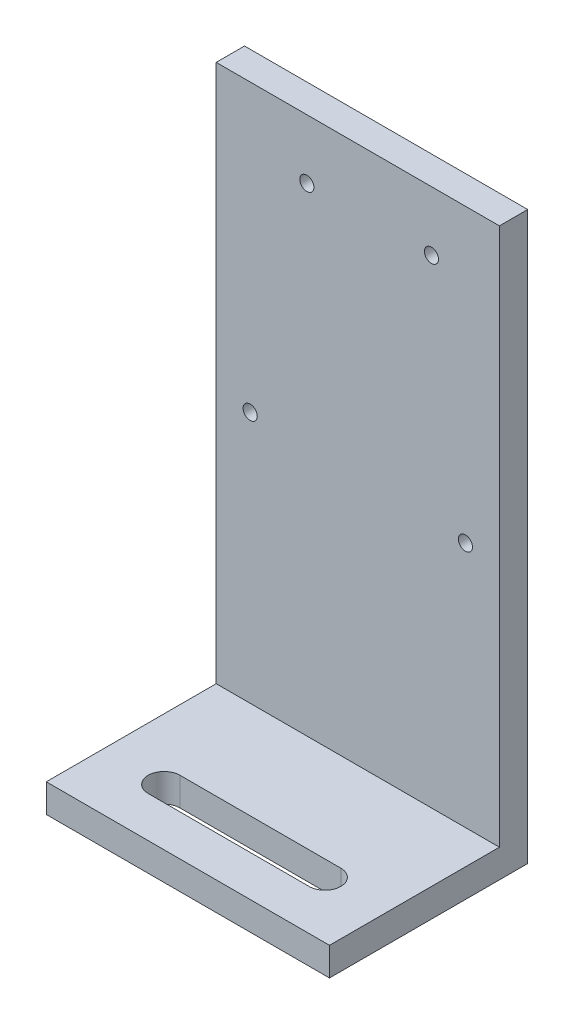
ISO-10303-21;
HEADER;
FILE_DESCRIPTION(('STEP AP214'),'2;1');
FILE_NAME('part.step','',(''),(''),'','','');
FILE_SCHEMA(('AUTOMOTIVE_DESIGN { 1 0 10303 214 1 1 1 1 }'));
ENDSEC;
DATA;
#1=APPLICATION_CONTEXT('core data for automotive mechanical design processes');
#2=APPLICATION_PROTOCOL_DEFINITION('international standard','automotive_design',2000,#1);
#3=PRODUCT_CONTEXT('',#1,'mechanical');
#4=PRODUCT('Part','Part','',(#3));
#5=PRODUCT_RELATED_PRODUCT_CATEGORY('part','',(#4));
#6=PRODUCT_DEFINITION_FORMATION('','',#4);
#7=PRODUCT_DEFINITION_CONTEXT('part definition',#1,'design');
#8=PRODUCT_DEFINITION('design','',#6,#7);
#9=PRODUCT_DEFINITION_SHAPE('','',#8);
#10=(LENGTH_UNIT() NAMED_UNIT(*) SI_UNIT(.MILLI.,.METRE.));
#11=(NAMED_UNIT(*) PLANE_ANGLE_UNIT() SI_UNIT($,.RADIAN.));
#12=(NAMED_UNIT(*) SI_UNIT($,.STERADIAN.) SOLID_ANGLE_UNIT());
#13=UNCERTAINTY_MEASURE_WITH_UNIT(LENGTH_MEASURE(1.E-05),#10,'distance_accuracy_value','');
#14=(GEOMETRIC_REPRESENTATION_CONTEXT(3) GLOBAL_UNCERTAINTY_ASSIGNED_CONTEXT((#13)) GLOBAL_UNIT_ASSIGNED_CONTEXT((#10,
#11,#12)) REPRESENTATION_CONTEXT('',''));
#15=CARTESIAN_POINT('',(0.,0.,0.));
#16=DIRECTION('',(0.,0.,1.));
#17=DIRECTION('',(1.,0.,0.));
#18=AXIS2_PLACEMENT_3D('',#15,#16,#17);
#19=CARTESIAN_POINT('',(0.,0.,6.35));
#20=DIRECTION('',(0.,1.,0.));
#21=DIRECTION('',(0.,0.,1.));
#22=AXIS2_PLACEMENT_3D('',#19,#20,#21);
#23=PLANE('',#22);
#24=DIRECTION('',(1.,0.,0.));
#25=VECTOR('',#24,1.);
#26=CARTESIAN_POINT('',(0.,0.,0.));
#27=LINE('',#26,#25);
#28=CARTESIAN_POINT('',(0.,0.,0.));
#29=VERTEX_POINT('',#28);
#30=CARTESIAN_POINT('',(63.5,0.,0.));
#31=VERTEX_POINT('',#30);
#32=EDGE_CURVE('E227',#29,#31,#27,.T.);
#33=ORIENTED_EDGE('',*,*,#32,.T.);
#34=DIRECTION('',(0.,0.,-1.));
#35=VECTOR('',#34,1.);
#36=CARTESIAN_POINT('',(63.5,0.,6.35));
#37=LINE('',#36,#35);
#38=CARTESIAN_POINT('',(63.5,0.,44.45));
#39=VERTEX_POINT('',#38);
#40=EDGE_CURVE('E49',#39,#31,#37,.T.);
#41=ORIENTED_EDGE('',*,*,#40,.F.);
#42=DIRECTION('',(1.,0.,0.));
#43=VECTOR('',#42,1.);
#44=CARTESIAN_POINT('',(0.,0.,44.45));
#45=LINE('',#44,#43);
#46=CARTESIAN_POINT('',(0.,0.,44.45));
#47=VERTEX_POINT('',#46);
#48=EDGE_CURVE('E169',#47,#39,#45,.T.);
#49=ORIENTED_EDGE('',*,*,#48,.F.);
#50=DIRECTION('',(0.,0.,-1.));
#51=VECTOR('',#50,1.);
#52=CARTESIAN_POINT('',(0.,0.,6.35));
#53=LINE('',#52,#51);
#54=EDGE_CURVE('E11',#47,#29,#53,.T.);
#55=ORIENTED_EDGE('',*,*,#54,.T.);
#56=EDGE_LOOP('',(#33,#41,#49,#55));
#57=FACE_BOUND('',#56,.T.);
#58=DIRECTION('',(1.,0.,0.));
#59=VECTOR('',#58,1.);
#60=CARTESIAN_POINT('',(13.716,0.,28.194));
#61=LINE('',#60,#59);
#62=CARTESIAN_POINT('',(13.716,0.,28.194));
#63=VERTEX_POINT('',#62);
#64=CARTESIAN_POINT('',(49.784,0.,28.194));
#65=VERTEX_POINT('',#64);
#66=EDGE_CURVE('E116',#63,#65,#61,.T.);
#67=ORIENTED_EDGE('',*,*,#66,.F.);
#68=CARTESIAN_POINT('',(13.716,0.,31.75));
#69=DIRECTION('',(0.,1.,0.));
#70=DIRECTION('',(0.,0.,1.));
#71=AXIS2_PLACEMENT_3D('',#68,#69,#70);
#72=CIRCLE('',#71,3.556);
#73=CARTESIAN_POINT('',(13.716,0.,35.306));
#74=VERTEX_POINT('',#73);
#75=EDGE_CURVE('E142',#63,#74,#72,.T.);
#76=ORIENTED_EDGE('',*,*,#75,.T.);
#77=DIRECTION('',(1.,0.,0.));
#78=VECTOR('',#77,1.);
#79=CARTESIAN_POINT('',(13.716,0.,35.306));
#80=LINE('',#79,#78);
#81=CARTESIAN_POINT('',(49.784,0.,35.306));
#82=VERTEX_POINT('',#81);
#83=EDGE_CURVE('E57',#74,#82,#80,.T.);
#84=ORIENTED_EDGE('',*,*,#83,.T.);
#85=CARTESIAN_POINT('',(49.784,0.,31.75));
#86=DIRECTION('',(0.,1.,0.));
#87=DIRECTION('',(0.,0.,1.));
#88=AXIS2_PLACEMENT_3D('',#85,#86,#87);
#89=CIRCLE('',#88,3.556);
#90=EDGE_CURVE('E127',#82,#65,#89,.T.);
#91=ORIENTED_EDGE('',*,*,#90,.T.);
#92=EDGE_LOOP('',(#67,#76,#84,#91));
#93=FACE_BOUND('',#92,.T.);
#94=ADVANCED_FACE('F39',(#57,#93),#23,.F.);
#95=CARTESIAN_POINT('',(0.,6.35,44.45));
#96=DIRECTION('',(0.,-1.,0.));
#97=DIRECTION('',(0.,0.,-1.));
#98=AXIS2_PLACEMENT_3D('',#95,#96,#97);
#99=PLANE('',#98);
#100=DIRECTION('',(-1.,0.,0.));
#101=VECTOR('',#100,1.);
#102=CARTESIAN_POINT('',(0.,6.35,6.35));
#103=LINE('',#102,#101);
#104=CARTESIAN_POINT('',(63.5,6.35,6.35));
#105=VERTEX_POINT('',#104);
#106=CARTESIAN_POINT('',(0.,6.35,6.35));
#107=VERTEX_POINT('',#106);
#108=EDGE_CURVE('E136',#105,#107,#103,.T.);
#109=ORIENTED_EDGE('',*,*,#108,.T.);
#110=DIRECTION('',(0.,0.,-1.));
#111=VECTOR('',#110,1.);
#112=CARTESIAN_POINT('',(0.,6.35,44.45));
#113=LINE('',#112,#111);
#114=CARTESIAN_POINT('',(0.,6.35,44.45));
#115=VERTEX_POINT('',#114);
#116=EDGE_CURVE('E179',#115,#107,#113,.T.);
#117=ORIENTED_EDGE('',*,*,#116,.F.);
#118=DIRECTION('',(-1.,0.,0.));
#119=VECTOR('',#118,1.);
#120=CARTESIAN_POINT('',(0.,6.35,44.45));
#121=LINE('',#120,#119);
#122=CARTESIAN_POINT('',(63.5,6.35,44.45));
#123=VERTEX_POINT('',#122);
#124=EDGE_CURVE('E176',#123,#115,#121,.T.);
#125=ORIENTED_EDGE('',*,*,#124,.F.);
#126=DIRECTION('',(0.,0.,-1.));
#127=VECTOR('',#126,1.);
#128=CARTESIAN_POINT('',(63.5,6.35,44.45));
#129=LINE('',#128,#127);
#130=EDGE_CURVE('E186',#123,#105,#129,.T.);
#131=ORIENTED_EDGE('',*,*,#130,.T.);
#132=EDGE_LOOP('',(#109,#117,#125,#131));
#133=FACE_BOUND('',#132,.T.);
#134=DIRECTION('',(1.,0.,0.));
#135=VECTOR('',#134,1.);
#136=CARTESIAN_POINT('',(13.716,6.35,28.194));
#137=LINE('',#136,#135);
#138=CARTESIAN_POINT('',(13.716,6.35,28.194));
#139=VERTEX_POINT('',#138);
#140=CARTESIAN_POINT('',(49.784,6.35,28.194));
#141=VERTEX_POINT('',#140);
#142=EDGE_CURVE('E65',#139,#141,#137,.T.);
#143=ORIENTED_EDGE('',*,*,#142,.T.);
#144=CARTESIAN_POINT('',(49.784,6.35,31.75));
#145=DIRECTION('',(0.,1.,0.));
#146=DIRECTION('',(0.,0.,1.));
#147=AXIS2_PLACEMENT_3D('',#144,#145,#146);
#148=CIRCLE('',#147,3.556);
#149=CARTESIAN_POINT('',(49.784,6.35,35.306));
#150=VERTEX_POINT('',#149);
#151=EDGE_CURVE('E134',#150,#141,#148,.T.);
#152=ORIENTED_EDGE('',*,*,#151,.F.);
#153=DIRECTION('',(1.,0.,0.));
#154=VECTOR('',#153,1.);
#155=CARTESIAN_POINT('',(13.716,6.35,35.306));
#156=LINE('',#155,#154);
#157=CARTESIAN_POINT('',(13.716,6.35,35.306));
#158=VERTEX_POINT('',#157);
#159=EDGE_CURVE('E151',#158,#150,#156,.T.);
#160=ORIENTED_EDGE('',*,*,#159,.F.);
#161=CARTESIAN_POINT('',(13.716,6.35,31.75));
#162=DIRECTION('',(0.,1.,0.));
#163=DIRECTION('',(0.,0.,1.));
#164=AXIS2_PLACEMENT_3D('',#161,#162,#163);
#165=CIRCLE('',#164,3.556);
#166=EDGE_CURVE('E128',#139,#158,#165,.T.);
#167=ORIENTED_EDGE('',*,*,#166,.F.);
#168=EDGE_LOOP('',(#143,#152,#160,#167));
#169=FACE_BOUND('',#168,.T.);
#170=ADVANCED_FACE('F277',(#133,#169),#99,.F.);
#171=CARTESIAN_POINT('',(0.,0.,6.35));
#172=DIRECTION('',(0.,0.,-1.));
#173=DIRECTION('',(-1.,0.,0.));
#174=AXIS2_PLACEMENT_3D('',#171,#172,#173);
#175=PLANE('',#174);
#176=CARTESIAN_POINT('',(48.26,113.665,6.35));
#177=DIRECTION('',(0.,0.,1.));
#178=DIRECTION('',(1.,0.,0.));
#179=AXIS2_PLACEMENT_3D('',#176,#177,#178);
#180=CIRCLE('',#179,1.5875);
#181=CARTESIAN_POINT('',(49.8475,113.665,6.35));
#182=VERTEX_POINT('',#181);
#183=EDGE_CURVE('E190',#182,#182,#180,.T.);
#184=ORIENTED_EDGE('',*,*,#183,.F.);
#185=EDGE_LOOP('',(#184));
#186=FACE_BOUND('',#185,.T.);
#187=CARTESIAN_POINT('',(20.32,113.665,6.35));
#188=DIRECTION('',(0.,0.,1.));
#189=DIRECTION('',(1.,0.,0.));
#190=AXIS2_PLACEMENT_3D('',#187,#188,#189);
#191=CIRCLE('',#190,1.5875);
#192=CARTESIAN_POINT('',(21.9075,113.665,6.35));
#193=VERTEX_POINT('',#192);
#194=EDGE_CURVE('E212',#193,#193,#191,.T.);
#195=ORIENTED_EDGE('',*,*,#194,.F.);
#196=EDGE_LOOP('',(#195));
#197=FACE_BOUND('',#196,.T.);
#198=CARTESIAN_POINT('',(7.62,62.865,6.35));
#199=DIRECTION('',(0.,0.,1.));
#200=DIRECTION('',(1.,0.,0.));
#201=AXIS2_PLACEMENT_3D('',#198,#199,#200);
#202=CIRCLE('',#201,1.5875);
#203=CARTESIAN_POINT('',(9.2075,62.865,6.35));
#204=VERTEX_POINT('',#203);
#205=EDGE_CURVE('E204',#204,#204,#202,.T.);
#206=ORIENTED_EDGE('',*,*,#205,.F.);
#207=EDGE_LOOP('',(#206));
#208=FACE_BOUND('',#207,.T.);
#209=CARTESIAN_POINT('',(55.88,61.595,6.35));
#210=DIRECTION('',(0.,0.,1.));
#211=DIRECTION('',(1.,0.,0.));
#212=AXIS2_PLACEMENT_3D('',#209,#210,#211);
#213=CIRCLE('',#212,1.5875);
#214=CARTESIAN_POINT('',(57.4675,61.595,6.35));
#215=VERTEX_POINT('',#214);
#216=EDGE_CURVE('E196',#215,#215,#213,.T.);
#217=ORIENTED_EDGE('',*,*,#216,.F.);
#218=EDGE_LOOP('',(#217));
#219=FACE_BOUND('',#218,.T.);
#220=ORIENTED_EDGE('',*,*,#108,.F.);
#221=DIRECTION('',(0.,1.,0.));
#222=VECTOR('',#221,1.);
#223=CARTESIAN_POINT('',(63.5,0.,6.35));
#224=LINE('',#223,#222);
#225=CARTESIAN_POINT('',(63.5,127.,6.35));
#226=VERTEX_POINT('',#225);
#227=EDGE_CURVE('E231',#105,#226,#224,.T.);
#228=ORIENTED_EDGE('',*,*,#227,.T.);
#229=DIRECTION('',(1.,0.,0.));
#230=VECTOR('',#229,1.);
#231=CARTESIAN_POINT('',(0.,127.,6.35));
#232=LINE('',#231,#230);
#233=CARTESIAN_POINT('',(0.,127.,6.35));
#234=VERTEX_POINT('',#233);
#235=EDGE_CURVE('E226',#234,#226,#232,.T.);
#236=ORIENTED_EDGE('',*,*,#235,.F.);
#237=DIRECTION('',(0.,1.,0.));
#238=VECTOR('',#237,1.);
#239=CARTESIAN_POINT('',(0.,0.,6.35));
#240=LINE('',#239,#238);
#241=EDGE_CURVE('E223',#107,#234,#240,.T.);
#242=ORIENTED_EDGE('',*,*,#241,.F.);
#243=EDGE_LOOP('',(#220,#228,#236,#242));
#244=FACE_BOUND('',#243,.T.);
#245=ADVANCED_FACE('F280',(#186,#197,#208,#219,#244),#175,.F.);
#246=CARTESIAN_POINT('',(0.,0.,6.35));
#247=DIRECTION('',(-1.,0.,0.));
#248=DIRECTION('',(0.,0.,1.));
#249=AXIS2_PLACEMENT_3D('',#246,#247,#248);
#250=PLANE('',#249);
#251=DIRECTION('',(0.,1.,0.));
#252=VECTOR('',#251,1.);
#253=CARTESIAN_POINT('',(0.,0.,0.));
#254=LINE('',#253,#252);
#255=CARTESIAN_POINT('',(0.,127.,0.));
#256=VERTEX_POINT('',#255);
#257=EDGE_CURVE('E195',#29,#256,#254,.T.);
#258=ORIENTED_EDGE('',*,*,#257,.F.);
#259=ORIENTED_EDGE('',*,*,#54,.F.);
#260=DIRECTION('',(0.,-1.,0.));
#261=VECTOR('',#260,1.);
#262=CARTESIAN_POINT('',(0.,0.,44.45));
#263=LINE('',#262,#261);
#264=EDGE_CURVE('E165',#115,#47,#263,.T.);
#265=ORIENTED_EDGE('',*,*,#264,.F.);
#266=ORIENTED_EDGE('',*,*,#116,.T.);
#267=ORIENTED_EDGE('',*,*,#241,.T.);
#268=DIRECTION('',(0.,0.,-1.));
#269=VECTOR('',#268,1.);
#270=CARTESIAN_POINT('',(0.,127.,6.35));
#271=LINE('',#270,#269);
#272=EDGE_CURVE('E43',#234,#256,#271,.T.);
#273=ORIENTED_EDGE('',*,*,#272,.T.);
#274=EDGE_LOOP('',(#258,#259,#265,#266,#267,#273));
#275=FACE_BOUND('',#274,.T.);
#276=ADVANCED_FACE('F41',(#275),#250,.T.);
#277=CARTESIAN_POINT('',(63.5,0.,6.35));
#278=DIRECTION('',(-1.,0.,0.));
#279=DIRECTION('',(0.,-1.,0.));
#280=AXIS2_PLACEMENT_3D('',#277,#278,#279);
#281=PLANE('',#280);
#282=DIRECTION('',(0.,1.,0.));
#283=VECTOR('',#282,1.);
#284=CARTESIAN_POINT('',(63.5,0.,0.));
#285=LINE('',#284,#283);
#286=CARTESIAN_POINT('',(63.5,127.,0.));
#287=VERTEX_POINT('',#286);
#288=EDGE_CURVE('E241',#31,#287,#285,.T.);
#289=ORIENTED_EDGE('',*,*,#288,.T.);
#290=DIRECTION('',(0.,0.,-1.));
#291=VECTOR('',#290,1.);
#292=CARTESIAN_POINT('',(63.5,127.,6.35));
#293=LINE('',#292,#291);
#294=EDGE_CURVE('E249',#226,#287,#293,.T.);
#295=ORIENTED_EDGE('',*,*,#294,.F.);
#296=ORIENTED_EDGE('',*,*,#227,.F.);
#297=ORIENTED_EDGE('',*,*,#130,.F.);
#298=DIRECTION('',(0.,1.,0.));
#299=VECTOR('',#298,1.);
#300=CARTESIAN_POINT('',(63.5,0.,44.45));
#301=LINE('',#300,#299);
#302=EDGE_CURVE('E173',#39,#123,#301,.T.);
#303=ORIENTED_EDGE('',*,*,#302,.F.);
#304=ORIENTED_EDGE('',*,*,#40,.T.);
#305=EDGE_LOOP('',(#289,#295,#296,#297,#303,#304));
#306=FACE_BOUND('',#305,.T.);
#307=ADVANCED_FACE('F268',(#306),#281,.F.);
#308=CARTESIAN_POINT('',(0.,127.,6.35));
#309=DIRECTION('',(0.,1.,0.));
#310=DIRECTION('',(0.,0.,1.));
#311=AXIS2_PLACEMENT_3D('',#308,#309,#310);
#312=PLANE('',#311);
#313=DIRECTION('',(1.,0.,0.));
#314=VECTOR('',#313,1.);
#315=CARTESIAN_POINT('',(0.,127.,0.));
#316=LINE('',#315,#314);
#317=EDGE_CURVE('E237',#256,#287,#316,.T.);
#318=ORIENTED_EDGE('',*,*,#317,.F.);
#319=ORIENTED_EDGE('',*,*,#272,.F.);
#320=ORIENTED_EDGE('',*,*,#235,.T.);
#321=ORIENTED_EDGE('',*,*,#294,.T.);
#322=EDGE_LOOP('',(#318,#319,#320,#321));
#323=FACE_BOUND('',#322,.T.);
#324=ADVANCED_FACE('F259',(#323),#312,.T.);
#325=CARTESIAN_POINT('',(0.,0.,0.));
#326=DIRECTION('',(0.,0.,-1.));
#327=DIRECTION('',(-1.,0.,0.));
#328=AXIS2_PLACEMENT_3D('',#325,#326,#327);
#329=PLANE('',#328);
#330=CARTESIAN_POINT('',(55.88,61.595,0.));
#331=DIRECTION('',(0.,0.,1.));
#332=DIRECTION('',(1.,0.,0.));
#333=AXIS2_PLACEMENT_3D('',#330,#331,#332);
#334=CIRCLE('',#333,1.5875);
#335=CARTESIAN_POINT('',(57.4675,61.595,0.));
#336=VERTEX_POINT('',#335);
#337=EDGE_CURVE('E191',#336,#336,#334,.T.);
#338=ORIENTED_EDGE('',*,*,#337,.T.);
#339=EDGE_LOOP('',(#338));
#340=FACE_BOUND('',#339,.T.);
#341=CARTESIAN_POINT('',(7.62,62.865,0.));
#342=DIRECTION('',(0.,0.,1.));
#343=DIRECTION('',(1.,0.,0.));
#344=AXIS2_PLACEMENT_3D('',#341,#342,#343);
#345=CIRCLE('',#344,1.5875);
#346=CARTESIAN_POINT('',(9.2075,62.865,0.));
#347=VERTEX_POINT('',#346);
#348=EDGE_CURVE('E200',#347,#347,#345,.T.);
#349=ORIENTED_EDGE('',*,*,#348,.T.);
#350=EDGE_LOOP('',(#349));
#351=FACE_BOUND('',#350,.T.);
#352=CARTESIAN_POINT('',(20.32,113.665,0.));
#353=DIRECTION('',(0.,0.,1.));
#354=DIRECTION('',(1.,0.,0.));
#355=AXIS2_PLACEMENT_3D('',#352,#353,#354);
#356=CIRCLE('',#355,1.5875);
#357=CARTESIAN_POINT('',(21.9075,113.665,0.));
#358=VERTEX_POINT('',#357);
#359=EDGE_CURVE('E208',#358,#358,#356,.T.);
#360=ORIENTED_EDGE('',*,*,#359,.T.);
#361=EDGE_LOOP('',(#360));
#362=FACE_BOUND('',#361,.T.);
#363=CARTESIAN_POINT('',(48.26,113.665,0.));
#364=DIRECTION('',(0.,0.,1.));
#365=DIRECTION('',(1.,0.,0.));
#366=AXIS2_PLACEMENT_3D('',#363,#364,#365);
#367=CIRCLE('',#366,1.5875);
#368=CARTESIAN_POINT('',(49.8475,113.665,0.));
#369=VERTEX_POINT('',#368);
#370=EDGE_CURVE('E216',#369,#369,#367,.T.);
#371=ORIENTED_EDGE('',*,*,#370,.T.);
#372=EDGE_LOOP('',(#371));
#373=FACE_BOUND('',#372,.T.);
#374=ORIENTED_EDGE('',*,*,#257,.T.);
#375=ORIENTED_EDGE('',*,*,#317,.T.);
#376=ORIENTED_EDGE('',*,*,#288,.F.);
#377=ORIENTED_EDGE('',*,*,#32,.F.);
#378=EDGE_LOOP('',(#374,#375,#376,#377));
#379=FACE_BOUND('',#378,.T.);
#380=ADVANCED_FACE('F263',(#340,#351,#362,#373,#379),#329,.T.);
#381=CARTESIAN_POINT('',(48.26,113.665,0.));
#382=DIRECTION('',(0.,0.,1.));
#383=DIRECTION('',(1.,0.,0.));
#384=AXIS2_PLACEMENT_3D('',#381,#382,#383);
#385=CYLINDRICAL_SURFACE('',#384,1.5875);
#386=ORIENTED_EDGE('',*,*,#370,.F.);
#387=EDGE_LOOP('',(#386));
#388=FACE_BOUND('',#387,.T.);
#389=ORIENTED_EDGE('',*,*,#183,.T.);
#390=EDGE_LOOP('',(#389));
#391=FACE_BOUND('',#390,.T.);
#392=ADVANCED_FACE('F303',(#388,#391),#385,.F.);
#393=CARTESIAN_POINT('',(20.32,113.665,0.));
#394=DIRECTION('',(0.,0.,1.));
#395=DIRECTION('',(1.,0.,0.));
#396=AXIS2_PLACEMENT_3D('',#393,#394,#395);
#397=CYLINDRICAL_SURFACE('',#396,1.5875);
#398=ORIENTED_EDGE('',*,*,#359,.F.);
#399=EDGE_LOOP('',(#398));
#400=FACE_BOUND('',#399,.T.);
#401=ORIENTED_EDGE('',*,*,#194,.T.);
#402=EDGE_LOOP('',(#401));
#403=FACE_BOUND('',#402,.T.);
#404=ADVANCED_FACE('F308',(#400,#403),#397,.F.);
#405=CARTESIAN_POINT('',(7.62,62.865,0.));
#406=DIRECTION('',(0.,0.,1.));
#407=DIRECTION('',(1.,0.,0.));
#408=AXIS2_PLACEMENT_3D('',#405,#406,#407);
#409=CYLINDRICAL_SURFACE('',#408,1.5875);
#410=ORIENTED_EDGE('',*,*,#348,.F.);
#411=EDGE_LOOP('',(#410));
#412=FACE_BOUND('',#411,.T.);
#413=ORIENTED_EDGE('',*,*,#205,.T.);
#414=EDGE_LOOP('',(#413));
#415=FACE_BOUND('',#414,.T.);
#416=ADVANCED_FACE('F321',(#412,#415),#409,.F.);
#417=CARTESIAN_POINT('',(55.88,61.595,0.));
#418=DIRECTION('',(0.,0.,1.));
#419=DIRECTION('',(1.,0.,0.));
#420=AXIS2_PLACEMENT_3D('',#417,#418,#419);
#421=CYLINDRICAL_SURFACE('',#420,1.5875);
#422=ORIENTED_EDGE('',*,*,#337,.F.);
#423=EDGE_LOOP('',(#422));
#424=FACE_BOUND('',#423,.T.);
#425=ORIENTED_EDGE('',*,*,#216,.T.);
#426=EDGE_LOOP('',(#425));
#427=FACE_BOUND('',#426,.T.);
#428=ADVANCED_FACE('F329',(#424,#427),#421,.F.);
#429=CARTESIAN_POINT('',(0.,0.,44.45));
#430=DIRECTION('',(0.,0.,-1.));
#431=DIRECTION('',(-1.,0.,0.));
#432=AXIS2_PLACEMENT_3D('',#429,#430,#431);
#433=PLANE('',#432);
#434=ORIENTED_EDGE('',*,*,#264,.T.);
#435=ORIENTED_EDGE('',*,*,#48,.T.);
#436=ORIENTED_EDGE('',*,*,#302,.T.);
#437=ORIENTED_EDGE('',*,*,#124,.T.);
#438=EDGE_LOOP('',(#434,#435,#436,#437));
#439=FACE_BOUND('',#438,.T.);
#440=ADVANCED_FACE('F273',(#439),#433,.F.);
#441=CARTESIAN_POINT('',(13.716,0.,28.194));
#442=DIRECTION('',(0.,0.,1.));
#443=DIRECTION('',(1.,0.,0.));
#444=AXIS2_PLACEMENT_3D('',#441,#442,#443);
#445=PLANE('',#444);
#446=ORIENTED_EDGE('',*,*,#142,.F.);
#447=DIRECTION('',(0.,1.,0.));
#448=VECTOR('',#447,1.);
#449=CARTESIAN_POINT('',(13.716,0.,28.194));
#450=LINE('',#449,#448);
#451=EDGE_CURVE('E121',#63,#139,#450,.T.);
#452=ORIENTED_EDGE('',*,*,#451,.F.);
#453=ORIENTED_EDGE('',*,*,#66,.T.);
#454=DIRECTION('',(0.,1.,0.));
#455=VECTOR('',#454,1.);
#456=CARTESIAN_POINT('',(49.784,0.,28.194));
#457=LINE('',#456,#455);
#458=EDGE_CURVE('E119',#65,#141,#457,.T.);
#459=ORIENTED_EDGE('',*,*,#458,.T.);
#460=EDGE_LOOP('',(#446,#452,#453,#459));
#461=FACE_BOUND('',#460,.T.);
#462=ADVANCED_FACE('F118',(#461),#445,.T.);
#463=CARTESIAN_POINT('',(49.784,0.,31.75));
#464=DIRECTION('',(0.,1.,0.));
#465=DIRECTION('',(0.,0.,1.));
#466=AXIS2_PLACEMENT_3D('',#463,#464,#465);
#467=CYLINDRICAL_SURFACE('',#466,3.556);
#468=ORIENTED_EDGE('',*,*,#151,.T.);
#469=ORIENTED_EDGE('',*,*,#458,.F.);
#470=ORIENTED_EDGE('',*,*,#90,.F.);
#471=DIRECTION('',(0.,1.,0.));
#472=VECTOR('',#471,1.);
#473=CARTESIAN_POINT('',(49.784,0.,35.306));
#474=LINE('',#473,#472);
#475=EDGE_CURVE('E137',#82,#150,#474,.T.);
#476=ORIENTED_EDGE('',*,*,#475,.T.);
#477=EDGE_LOOP('',(#468,#469,#470,#476));
#478=FACE_BOUND('',#477,.T.);
#479=ADVANCED_FACE('F132',(#478),#467,.F.);
#480=CARTESIAN_POINT('',(13.716,0.,35.306));
#481=DIRECTION('',(0.,0.,1.));
#482=DIRECTION('',(1.,0.,0.));
#483=AXIS2_PLACEMENT_3D('',#480,#481,#482);
#484=PLANE('',#483);
#485=ORIENTED_EDGE('',*,*,#159,.T.);
#486=ORIENTED_EDGE('',*,*,#475,.F.);
#487=ORIENTED_EDGE('',*,*,#83,.F.);
#488=DIRECTION('',(0.,1.,0.));
#489=VECTOR('',#488,1.);
#490=CARTESIAN_POINT('',(13.716,0.,35.306));
#491=LINE('',#490,#489);
#492=EDGE_CURVE('E160',#74,#158,#491,.T.);
#493=ORIENTED_EDGE('',*,*,#492,.T.);
#494=EDGE_LOOP('',(#485,#486,#487,#493));
#495=FACE_BOUND('',#494,.T.);
#496=ADVANCED_FACE('F345',(#495),#484,.F.);
#497=CARTESIAN_POINT('',(13.716,0.,31.75));
#498=DIRECTION('',(0.,1.,0.));
#499=DIRECTION('',(0.,0.,1.));
#500=AXIS2_PLACEMENT_3D('',#497,#498,#499);
#501=CYLINDRICAL_SURFACE('',#500,3.556);
#502=ORIENTED_EDGE('',*,*,#166,.T.);
#503=ORIENTED_EDGE('',*,*,#492,.F.);
#504=ORIENTED_EDGE('',*,*,#75,.F.);
#505=ORIENTED_EDGE('',*,*,#451,.T.);
#506=EDGE_LOOP('',(#502,#503,#504,#505));
#507=FACE_BOUND('',#506,.T.);
#508=ADVANCED_FACE('F348',(#507),#501,.F.);
#509=CLOSED_SHELL('',(#94,#170,#245,#276,#307,#324,#380,#392,#404,#416,#428,#440,#462,#479,#496,#508));
#510=MANIFOLD_SOLID_BREP('B2',#509);
#511=ADVANCED_BREP_SHAPE_REPRESENTATION('',(#18,#510),#14);
#512=SHAPE_DEFINITION_REPRESENTATION(#9,#511);
ENDSEC;
END-ISO-10303-21;
